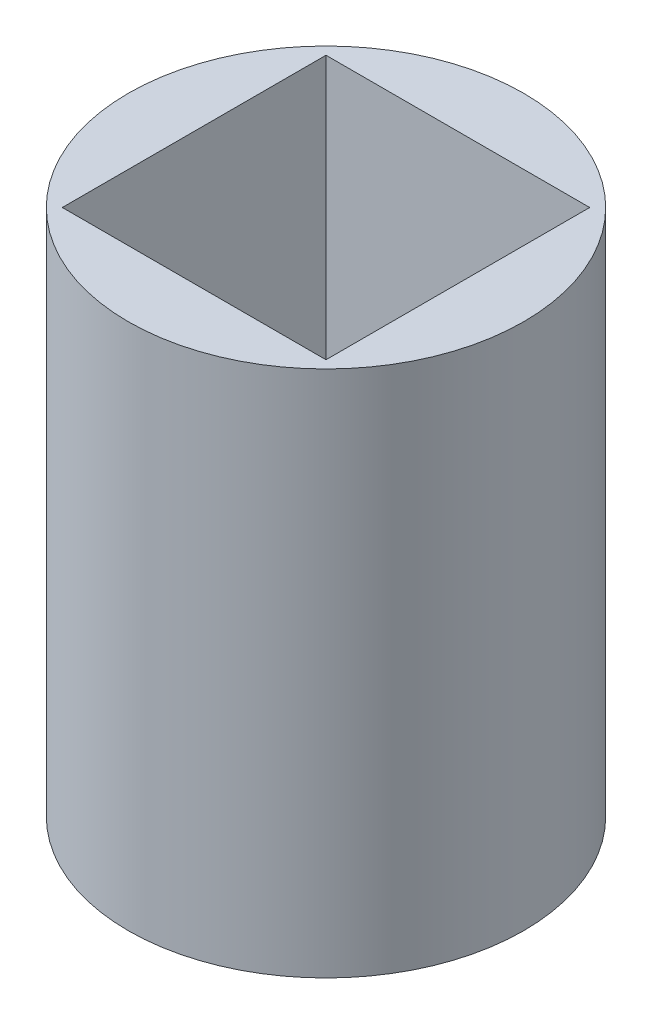
ISO-10303-21;
HEADER;
FILE_DESCRIPTION(('STEP AP214'),'2;1');
FILE_NAME('part.step','',(''),(''),'','','');
FILE_SCHEMA(('AUTOMOTIVE_DESIGN { 1 0 10303 214 1 1 1 1 }'));
ENDSEC;
DATA;
#1=APPLICATION_CONTEXT('core data for automotive mechanical design processes');
#2=APPLICATION_PROTOCOL_DEFINITION('international standard','automotive_design',2000,#1);
#3=PRODUCT_CONTEXT('',#1,'mechanical');
#4=PRODUCT('Part','Part','',(#3));
#5=PRODUCT_RELATED_PRODUCT_CATEGORY('part','',(#4));
#6=PRODUCT_DEFINITION_FORMATION('','',#4);
#7=PRODUCT_DEFINITION_CONTEXT('part definition',#1,'design');
#8=PRODUCT_DEFINITION('design','',#6,#7);
#9=PRODUCT_DEFINITION_SHAPE('','',#8);
#10=(LENGTH_UNIT() NAMED_UNIT(*) SI_UNIT(.MILLI.,.METRE.));
#11=(NAMED_UNIT(*) PLANE_ANGLE_UNIT() SI_UNIT($,.RADIAN.));
#12=(NAMED_UNIT(*) SI_UNIT($,.STERADIAN.) SOLID_ANGLE_UNIT());
#13=UNCERTAINTY_MEASURE_WITH_UNIT(LENGTH_MEASURE(1.E-05),#10,'distance_accuracy_value','');
#14=(GEOMETRIC_REPRESENTATION_CONTEXT(3) GLOBAL_UNCERTAINTY_ASSIGNED_CONTEXT((#13)) GLOBAL_UNIT_ASSIGNED_CONTEXT((#10,
#11,#12)) REPRESENTATION_CONTEXT('',''));
#15=CARTESIAN_POINT('',(0.,0.,0.));
#16=DIRECTION('',(0.,0.,1.));
#17=DIRECTION('',(1.,0.,0.));
#18=AXIS2_PLACEMENT_3D('',#15,#16,#17);
#19=CARTESIAN_POINT('',(0.,6.,0.));
#20=DIRECTION('',(0.,-1.,0.));
#21=DIRECTION('',(0.,0.,-1.));
#22=AXIS2_PLACEMENT_3D('',#19,#20,#21);
#23=CYLINDRICAL_SURFACE('',#22,2.25);
#24=CARTESIAN_POINT('',(0.,6.,0.));
#25=DIRECTION('',(0.,1.,0.));
#26=DIRECTION('',(0.,0.,1.));
#27=AXIS2_PLACEMENT_3D('',#24,#25,#26);
#28=CIRCLE('',#27,2.25);
#29=CARTESIAN_POINT('',(0.,6.,2.25));
#30=VERTEX_POINT('',#29);
#31=EDGE_CURVE('E11',#30,#30,#28,.T.);
#32=ORIENTED_EDGE('',*,*,#31,.F.);
#33=EDGE_LOOP('',(#32));
#34=FACE_BOUND('',#33,.T.);
#35=CARTESIAN_POINT('',(0.,0.,0.));
#36=DIRECTION('',(0.,1.,0.));
#37=DIRECTION('',(0.,0.,1.));
#38=AXIS2_PLACEMENT_3D('',#35,#36,#37);
#39=CIRCLE('',#38,2.25);
#40=CARTESIAN_POINT('',(0.,0.,2.25));
#41=VERTEX_POINT('',#40);
#42=EDGE_CURVE('E38',#41,#41,#39,.T.);
#43=ORIENTED_EDGE('',*,*,#42,.T.);
#44=EDGE_LOOP('',(#43));
#45=FACE_BOUND('',#44,.T.);
#46=ADVANCED_FACE('F35',(#34,#45),#23,.T.);
#47=CARTESIAN_POINT('',(0.,6.,0.));
#48=DIRECTION('',(0.,1.,0.));
#49=DIRECTION('',(0.,0.,1.));
#50=AXIS2_PLACEMENT_3D('',#47,#48,#49);
#51=PLANE('',#50);
#52=DIRECTION('',(0.,0.,-1.));
#53=VECTOR('',#52,1.);
#54=CARTESIAN_POINT('',(1.5,6.,1.5));
#55=LINE('',#54,#53);
#56=CARTESIAN_POINT('',(1.5,6.,1.5));
#57=VERTEX_POINT('',#56);
#58=CARTESIAN_POINT('',(1.5,6.,-1.5));
#59=VERTEX_POINT('',#58);
#60=EDGE_CURVE('E49',#57,#59,#55,.T.);
#61=ORIENTED_EDGE('',*,*,#60,.F.);
#62=DIRECTION('',(1.,0.,0.));
#63=VECTOR('',#62,1.);
#64=CARTESIAN_POINT('',(-1.5,6.,1.5));
#65=LINE('',#64,#63);
#66=CARTESIAN_POINT('',(-1.5,6.,1.5));
#67=VERTEX_POINT('',#66);
#68=EDGE_CURVE('E93',#67,#57,#65,.T.);
#69=ORIENTED_EDGE('',*,*,#68,.F.);
#70=DIRECTION('',(0.,0.,1.));
#71=VECTOR('',#70,1.);
#72=CARTESIAN_POINT('',(-1.5,6.,1.5));
#73=LINE('',#72,#71);
#74=CARTESIAN_POINT('',(-1.5,6.,-1.5));
#75=VERTEX_POINT('',#74);
#76=EDGE_CURVE('E96',#75,#67,#73,.T.);
#77=ORIENTED_EDGE('',*,*,#76,.F.);
#78=DIRECTION('',(-1.,0.,0.));
#79=VECTOR('',#78,1.);
#80=CARTESIAN_POINT('',(-1.5,6.,-1.5));
#81=LINE('',#80,#79);
#82=EDGE_CURVE('E102',#59,#75,#81,.T.);
#83=ORIENTED_EDGE('',*,*,#82,.F.);
#84=EDGE_LOOP('',(#61,#69,#77,#83));
#85=FACE_BOUND('',#84,.T.);
#86=ORIENTED_EDGE('',*,*,#31,.T.);
#87=EDGE_LOOP('',(#86));
#88=FACE_BOUND('',#87,.T.);
#89=ADVANCED_FACE('F114',(#85,#88),#51,.T.);
#90=CARTESIAN_POINT('',(0.,0.,0.));
#91=DIRECTION('',(0.,1.,0.));
#92=DIRECTION('',(0.,0.,1.));
#93=AXIS2_PLACEMENT_3D('',#90,#91,#92);
#94=PLANE('',#93);
#95=DIRECTION('',(1.,0.,0.));
#96=VECTOR('',#95,1.);
#97=CARTESIAN_POINT('',(-1.5,0.,1.5));
#98=LINE('',#97,#96);
#99=CARTESIAN_POINT('',(-1.5,0.,1.5));
#100=VERTEX_POINT('',#99);
#101=CARTESIAN_POINT('',(1.5,0.,1.5));
#102=VERTEX_POINT('',#101);
#103=EDGE_CURVE('E83',#100,#102,#98,.T.);
#104=ORIENTED_EDGE('',*,*,#103,.T.);
#105=DIRECTION('',(0.,0.,-1.));
#106=VECTOR('',#105,1.);
#107=CARTESIAN_POINT('',(1.5,0.,1.5));
#108=LINE('',#107,#106);
#109=CARTESIAN_POINT('',(1.5,0.,-1.5));
#110=VERTEX_POINT('',#109);
#111=EDGE_CURVE('E77',#102,#110,#108,.T.);
#112=ORIENTED_EDGE('',*,*,#111,.T.);
#113=DIRECTION('',(-1.,0.,0.));
#114=VECTOR('',#113,1.);
#115=CARTESIAN_POINT('',(-1.5,0.,-1.5));
#116=LINE('',#115,#114);
#117=CARTESIAN_POINT('',(-1.5,0.,-1.5));
#118=VERTEX_POINT('',#117);
#119=EDGE_CURVE('E86',#110,#118,#116,.T.);
#120=ORIENTED_EDGE('',*,*,#119,.T.);
#121=DIRECTION('',(0.,0.,1.));
#122=VECTOR('',#121,1.);
#123=CARTESIAN_POINT('',(-1.5,0.,1.5));
#124=LINE('',#123,#122);
#125=EDGE_CURVE('E57',#118,#100,#124,.T.);
#126=ORIENTED_EDGE('',*,*,#125,.T.);
#127=EDGE_LOOP('',(#104,#112,#120,#126));
#128=FACE_BOUND('',#127,.T.);
#129=ORIENTED_EDGE('',*,*,#42,.F.);
#130=EDGE_LOOP('',(#129));
#131=FACE_BOUND('',#130,.T.);
#132=ADVANCED_FACE('F90',(#128,#131),#94,.F.);
#133=CARTESIAN_POINT('',(1.5,0.,1.5));
#134=DIRECTION('',(1.,0.,0.));
#135=DIRECTION('',(0.,0.,-1.));
#136=AXIS2_PLACEMENT_3D('',#133,#134,#135);
#137=PLANE('',#136);
#138=ORIENTED_EDGE('',*,*,#60,.T.);
#139=DIRECTION('',(0.,1.,0.));
#140=VECTOR('',#139,1.);
#141=CARTESIAN_POINT('',(1.5,0.,-1.5));
#142=LINE('',#141,#140);
#143=EDGE_CURVE('E73',#110,#59,#142,.T.);
#144=ORIENTED_EDGE('',*,*,#143,.F.);
#145=ORIENTED_EDGE('',*,*,#111,.F.);
#146=DIRECTION('',(0.,1.,0.));
#147=VECTOR('',#146,1.);
#148=CARTESIAN_POINT('',(1.5,0.,1.5));
#149=LINE('',#148,#147);
#150=EDGE_CURVE('E106',#102,#57,#149,.T.);
#151=ORIENTED_EDGE('',*,*,#150,.T.);
#152=EDGE_LOOP('',(#138,#144,#145,#151));
#153=FACE_BOUND('',#152,.T.);
#154=ADVANCED_FACE('F75',(#153),#137,.F.);
#155=CARTESIAN_POINT('',(-1.5,0.,1.5));
#156=DIRECTION('',(0.,0.,1.));
#157=DIRECTION('',(1.,0.,0.));
#158=AXIS2_PLACEMENT_3D('',#155,#156,#157);
#159=PLANE('',#158);
#160=ORIENTED_EDGE('',*,*,#68,.T.);
#161=ORIENTED_EDGE('',*,*,#150,.F.);
#162=ORIENTED_EDGE('',*,*,#103,.F.);
#163=DIRECTION('',(0.,1.,0.));
#164=VECTOR('',#163,1.);
#165=CARTESIAN_POINT('',(-1.5,0.,1.5));
#166=LINE('',#165,#164);
#167=EDGE_CURVE('E108',#100,#67,#166,.T.);
#168=ORIENTED_EDGE('',*,*,#167,.T.);
#169=EDGE_LOOP('',(#160,#161,#162,#168));
#170=FACE_BOUND('',#169,.T.);
#171=ADVANCED_FACE('F117',(#170),#159,.F.);
#172=CARTESIAN_POINT('',(-1.5,0.,1.5));
#173=DIRECTION('',(-1.,0.,0.));
#174=DIRECTION('',(0.,0.,1.));
#175=AXIS2_PLACEMENT_3D('',#172,#173,#174);
#176=PLANE('',#175);
#177=ORIENTED_EDGE('',*,*,#76,.T.);
#178=ORIENTED_EDGE('',*,*,#167,.F.);
#179=ORIENTED_EDGE('',*,*,#125,.F.);
#180=DIRECTION('',(0.,1.,0.));
#181=VECTOR('',#180,1.);
#182=CARTESIAN_POINT('',(-1.5,0.,-1.5));
#183=LINE('',#182,#181);
#184=EDGE_CURVE('E82',#118,#75,#183,.T.);
#185=ORIENTED_EDGE('',*,*,#184,.T.);
#186=EDGE_LOOP('',(#177,#178,#179,#185));
#187=FACE_BOUND('',#186,.T.);
#188=ADVANCED_FACE('F110',(#187),#176,.F.);
#189=CARTESIAN_POINT('',(-1.5,0.,-1.5));
#190=DIRECTION('',(0.,0.,-1.));
#191=DIRECTION('',(-1.,0.,0.));
#192=AXIS2_PLACEMENT_3D('',#189,#190,#191);
#193=PLANE('',#192);
#194=ORIENTED_EDGE('',*,*,#82,.T.);
#195=ORIENTED_EDGE('',*,*,#184,.F.);
#196=ORIENTED_EDGE('',*,*,#119,.F.);
#197=ORIENTED_EDGE('',*,*,#143,.T.);
#198=EDGE_LOOP('',(#194,#195,#196,#197));
#199=FACE_BOUND('',#198,.T.);
#200=ADVANCED_FACE('F87',(#199),#193,.F.);
#201=CLOSED_SHELL('',(#46,#89,#132,#154,#171,#188,#200));
#202=MANIFOLD_SOLID_BREP('B2',#201);
#203=ADVANCED_BREP_SHAPE_REPRESENTATION('',(#18,#202),#14);
#204=SHAPE_DEFINITION_REPRESENTATION(#9,#203);
ENDSEC;
END-ISO-10303-21;
